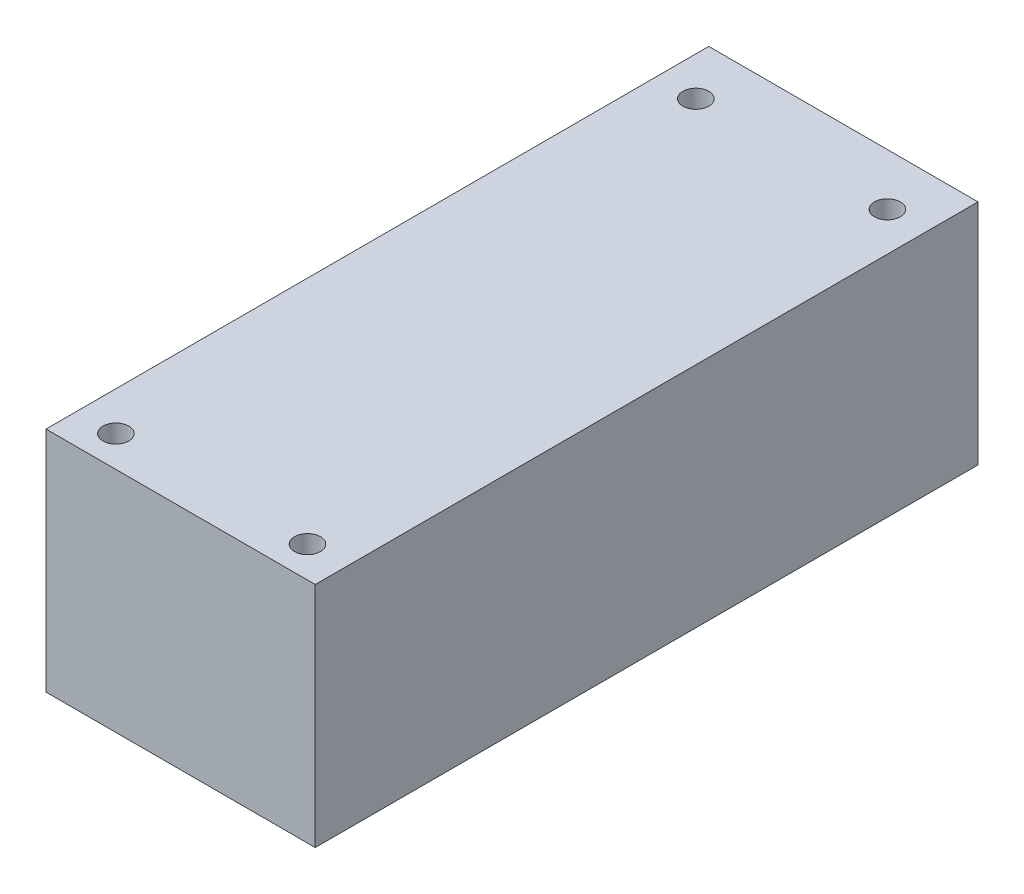
ISO-10303-21;
HEADER;
FILE_DESCRIPTION(('STEP AP214'),'2;1');
FILE_NAME('part.step','',(''),(''),'','','');
FILE_SCHEMA(('AUTOMOTIVE_DESIGN { 1 0 10303 214 1 1 1 1 }'));
ENDSEC;
DATA;
#1=APPLICATION_CONTEXT('core data for automotive mechanical design processes');
#2=APPLICATION_PROTOCOL_DEFINITION('international standard','automotive_design',2000,#1);
#3=PRODUCT_CONTEXT('',#1,'mechanical');
#4=PRODUCT('Part','Part','',(#3));
#5=PRODUCT_RELATED_PRODUCT_CATEGORY('part','',(#4));
#6=PRODUCT_DEFINITION_FORMATION('','',#4);
#7=PRODUCT_DEFINITION_CONTEXT('part definition',#1,'design');
#8=PRODUCT_DEFINITION('design','',#6,#7);
#9=PRODUCT_DEFINITION_SHAPE('','',#8);
#10=(LENGTH_UNIT() NAMED_UNIT(*) SI_UNIT(.MILLI.,.METRE.));
#11=(NAMED_UNIT(*) PLANE_ANGLE_UNIT() SI_UNIT($,.RADIAN.));
#12=(NAMED_UNIT(*) SI_UNIT($,.STERADIAN.) SOLID_ANGLE_UNIT());
#13=UNCERTAINTY_MEASURE_WITH_UNIT(LENGTH_MEASURE(1.E-05),#10,'distance_accuracy_value','');
#14=(GEOMETRIC_REPRESENTATION_CONTEXT(3) GLOBAL_UNCERTAINTY_ASSIGNED_CONTEXT((#13)) GLOBAL_UNIT_ASSIGNED_CONTEXT((#10,
#11,#12)) REPRESENTATION_CONTEXT('',''));
#15=CARTESIAN_POINT('',(0.,0.,0.));
#16=DIRECTION('',(0.,0.,1.));
#17=DIRECTION('',(1.,0.,0.));
#18=AXIS2_PLACEMENT_3D('',#15,#16,#17);
#19=CARTESIAN_POINT('',(-13.,11.,32.));
#20=DIRECTION('',(1.,0.,0.));
#21=DIRECTION('',(0.,1.,0.));
#22=AXIS2_PLACEMENT_3D('',#19,#20,#21);
#23=PLANE('',#22);
#24=DIRECTION('',(0.,-1.,0.));
#25=VECTOR('',#24,1.);
#26=CARTESIAN_POINT('',(-13.,11.,-32.));
#27=LINE('',#26,#25);
#28=CARTESIAN_POINT('',(-13.,11.,-32.));
#29=VERTEX_POINT('',#28);
#30=CARTESIAN_POINT('',(-13.,-11.,-32.));
#31=VERTEX_POINT('',#30);
#32=EDGE_CURVE('E101',#29,#31,#27,.T.);
#33=ORIENTED_EDGE('',*,*,#32,.T.);
#34=DIRECTION('',(0.,0.,-1.));
#35=VECTOR('',#34,1.);
#36=CARTESIAN_POINT('',(-13.,-11.,32.));
#37=LINE('',#36,#35);
#38=CARTESIAN_POINT('',(-13.,-11.,32.));
#39=VERTEX_POINT('',#38);
#40=EDGE_CURVE('E11',#39,#31,#37,.T.);
#41=ORIENTED_EDGE('',*,*,#40,.F.);
#42=DIRECTION('',(0.,-1.,0.));
#43=VECTOR('',#42,1.);
#44=CARTESIAN_POINT('',(-13.,11.,32.));
#45=LINE('',#44,#43);
#46=CARTESIAN_POINT('',(-13.,11.,32.));
#47=VERTEX_POINT('',#46);
#48=EDGE_CURVE('E89',#47,#39,#45,.T.);
#49=ORIENTED_EDGE('',*,*,#48,.F.);
#50=DIRECTION('',(0.,0.,-1.));
#51=VECTOR('',#50,1.);
#52=CARTESIAN_POINT('',(-13.,11.,32.));
#53=LINE('',#52,#51);
#54=EDGE_CURVE('E97',#47,#29,#53,.T.);
#55=ORIENTED_EDGE('',*,*,#54,.T.);
#56=EDGE_LOOP('',(#33,#41,#49,#55));
#57=FACE_BOUND('',#56,.T.);
#58=ADVANCED_FACE('F38',(#57),#23,.F.);
#59=CARTESIAN_POINT('',(13.,-11.,32.));
#60=DIRECTION('',(0.,1.,0.));
#61=DIRECTION('',(-1.,0.,0.));
#62=AXIS2_PLACEMENT_3D('',#59,#60,#61);
#63=PLANE('',#62);
#64=CARTESIAN_POINT('',(-9.25000000000001,-11.,29.));
#65=DIRECTION('',(0.,1.,0.));
#66=DIRECTION('',(-1.,0.,0.));
#67=AXIS2_PLACEMENT_3D('',#64,#65,#66);
#68=CIRCLE('',#67,1.25);
#69=CARTESIAN_POINT('',(-10.5,-11.,29.));
#70=VERTEX_POINT('',#69);
#71=EDGE_CURVE('E104',#70,#70,#68,.T.);
#72=ORIENTED_EDGE('',*,*,#71,.T.);
#73=EDGE_LOOP('',(#72));
#74=FACE_BOUND('',#73,.T.);
#75=CARTESIAN_POINT('',(-9.25000000000001,-11.,-27.));
#76=DIRECTION('',(0.,1.,0.));
#77=DIRECTION('',(-1.,0.,0.));
#78=AXIS2_PLACEMENT_3D('',#75,#76,#77);
#79=CIRCLE('',#78,1.25);
#80=CARTESIAN_POINT('',(-10.5,-11.,-27.));
#81=VERTEX_POINT('',#80);
#82=EDGE_CURVE('E117',#81,#81,#79,.T.);
#83=ORIENTED_EDGE('',*,*,#82,.T.);
#84=EDGE_LOOP('',(#83));
#85=FACE_BOUND('',#84,.T.);
#86=CARTESIAN_POINT('',(9.25000000000001,-11.,-27.));
#87=DIRECTION('',(0.,1.,0.));
#88=DIRECTION('',(-1.,0.,0.));
#89=AXIS2_PLACEMENT_3D('',#86,#87,#88);
#90=CIRCLE('',#89,1.25);
#91=CARTESIAN_POINT('',(8.00000000000001,-11.,-27.));
#92=VERTEX_POINT('',#91);
#93=EDGE_CURVE('E120',#92,#92,#90,.T.);
#94=ORIENTED_EDGE('',*,*,#93,.T.);
#95=EDGE_LOOP('',(#94));
#96=FACE_BOUND('',#95,.T.);
#97=CARTESIAN_POINT('',(9.25000000000001,-11.,29.));
#98=DIRECTION('',(0.,1.,0.));
#99=DIRECTION('',(-1.,0.,0.));
#100=AXIS2_PLACEMENT_3D('',#97,#98,#99);
#101=CIRCLE('',#100,1.25);
#102=CARTESIAN_POINT('',(8.00000000000001,-11.,29.));
#103=VERTEX_POINT('',#102);
#104=EDGE_CURVE('E123',#103,#103,#101,.T.);
#105=ORIENTED_EDGE('',*,*,#104,.T.);
#106=EDGE_LOOP('',(#105));
#107=FACE_BOUND('',#106,.T.);
#108=DIRECTION('',(1.,0.,0.));
#109=VECTOR('',#108,1.);
#110=CARTESIAN_POINT('',(13.,-11.,-32.));
#111=LINE('',#110,#109);
#112=CARTESIAN_POINT('',(13.,-11.,-32.));
#113=VERTEX_POINT('',#112);
#114=EDGE_CURVE('E93',#31,#113,#111,.T.);
#115=ORIENTED_EDGE('',*,*,#114,.T.);
#116=DIRECTION('',(0.,0.,-1.));
#117=VECTOR('',#116,1.);
#118=CARTESIAN_POINT('',(13.,-11.,32.));
#119=LINE('',#118,#117);
#120=CARTESIAN_POINT('',(13.,-11.,32.));
#121=VERTEX_POINT('',#120);
#122=EDGE_CURVE('E46',#121,#113,#119,.T.);
#123=ORIENTED_EDGE('',*,*,#122,.F.);
#124=DIRECTION('',(1.,0.,0.));
#125=VECTOR('',#124,1.);
#126=CARTESIAN_POINT('',(13.,-11.,32.));
#127=LINE('',#126,#125);
#128=EDGE_CURVE('E84',#39,#121,#127,.T.);
#129=ORIENTED_EDGE('',*,*,#128,.F.);
#130=ORIENTED_EDGE('',*,*,#40,.T.);
#131=EDGE_LOOP('',(#115,#123,#129,#130));
#132=FACE_BOUND('',#131,.T.);
#133=ADVANCED_FACE('F92',(#74,#85,#96,#107,#132),#63,.F.);
#134=CARTESIAN_POINT('',(13.,11.,32.));
#135=DIRECTION('',(-1.,0.,0.));
#136=DIRECTION('',(0.,0.,1.));
#137=AXIS2_PLACEMENT_3D('',#134,#135,#136);
#138=PLANE('',#137);
#139=DIRECTION('',(0.,1.,0.));
#140=VECTOR('',#139,1.);
#141=CARTESIAN_POINT('',(13.,11.,-32.));
#142=LINE('',#141,#140);
#143=CARTESIAN_POINT('',(13.,11.,-32.));
#144=VERTEX_POINT('',#143);
#145=EDGE_CURVE('E71',#113,#144,#142,.T.);
#146=ORIENTED_EDGE('',*,*,#145,.T.);
#147=DIRECTION('',(0.,0.,-1.));
#148=VECTOR('',#147,1.);
#149=CARTESIAN_POINT('',(13.,11.,32.));
#150=LINE('',#149,#148);
#151=CARTESIAN_POINT('',(13.,11.,32.));
#152=VERTEX_POINT('',#151);
#153=EDGE_CURVE('E94',#152,#144,#150,.T.);
#154=ORIENTED_EDGE('',*,*,#153,.F.);
#155=DIRECTION('',(0.,1.,0.));
#156=VECTOR('',#155,1.);
#157=CARTESIAN_POINT('',(13.,11.,32.));
#158=LINE('',#157,#156);
#159=EDGE_CURVE('E87',#121,#152,#158,.T.);
#160=ORIENTED_EDGE('',*,*,#159,.F.);
#161=ORIENTED_EDGE('',*,*,#122,.T.);
#162=EDGE_LOOP('',(#146,#154,#160,#161));
#163=FACE_BOUND('',#162,.T.);
#164=ADVANCED_FACE('F95',(#163),#138,.F.);
#165=CARTESIAN_POINT('',(13.,11.,32.));
#166=DIRECTION('',(0.,-1.,0.));
#167=DIRECTION('',(1.,0.,0.));
#168=AXIS2_PLACEMENT_3D('',#165,#166,#167);
#169=PLANE('',#168);
#170=CARTESIAN_POINT('',(-9.25000000000001,11.,29.));
#171=DIRECTION('',(0.,1.,0.));
#172=DIRECTION('',(1.,0.,0.));
#173=AXIS2_PLACEMENT_3D('',#170,#171,#172);
#174=CIRCLE('',#173,1.25);
#175=CARTESIAN_POINT('',(-8.00000000000001,11.,29.));
#176=VERTEX_POINT('',#175);
#177=EDGE_CURVE('E130',#176,#176,#174,.T.);
#178=ORIENTED_EDGE('',*,*,#177,.F.);
#179=EDGE_LOOP('',(#178));
#180=FACE_BOUND('',#179,.T.);
#181=CARTESIAN_POINT('',(-9.25000000000001,11.,-27.));
#182=DIRECTION('',(0.,1.,0.));
#183=DIRECTION('',(1.,0.,0.));
#184=AXIS2_PLACEMENT_3D('',#181,#182,#183);
#185=CIRCLE('',#184,1.25);
#186=CARTESIAN_POINT('',(-8.00000000000001,11.,-27.));
#187=VERTEX_POINT('',#186);
#188=EDGE_CURVE('E133',#187,#187,#185,.T.);
#189=ORIENTED_EDGE('',*,*,#188,.F.);
#190=EDGE_LOOP('',(#189));
#191=FACE_BOUND('',#190,.T.);
#192=CARTESIAN_POINT('',(9.25000000000001,11.,-27.));
#193=DIRECTION('',(0.,1.,0.));
#194=DIRECTION('',(-1.,0.,0.));
#195=AXIS2_PLACEMENT_3D('',#192,#193,#194);
#196=CIRCLE('',#195,1.25);
#197=CARTESIAN_POINT('',(8.00000000000001,11.,-27.));
#198=VERTEX_POINT('',#197);
#199=EDGE_CURVE('E129',#198,#198,#196,.T.);
#200=ORIENTED_EDGE('',*,*,#199,.F.);
#201=EDGE_LOOP('',(#200));
#202=FACE_BOUND('',#201,.T.);
#203=CARTESIAN_POINT('',(9.25000000000001,11.,29.));
#204=DIRECTION('',(0.,1.,0.));
#205=DIRECTION('',(-1.,0.,0.));
#206=AXIS2_PLACEMENT_3D('',#203,#204,#205);
#207=CIRCLE('',#206,1.25);
#208=CARTESIAN_POINT('',(8.00000000000001,11.,29.));
#209=VERTEX_POINT('',#208);
#210=EDGE_CURVE('E126',#209,#209,#207,.T.);
#211=ORIENTED_EDGE('',*,*,#210,.F.);
#212=EDGE_LOOP('',(#211));
#213=FACE_BOUND('',#212,.T.);
#214=DIRECTION('',(-1.,0.,0.));
#215=VECTOR('',#214,1.);
#216=CARTESIAN_POINT('',(13.,11.,-32.));
#217=LINE('',#216,#215);
#218=EDGE_CURVE('E77',#144,#29,#217,.T.);
#219=ORIENTED_EDGE('',*,*,#218,.T.);
#220=ORIENTED_EDGE('',*,*,#54,.F.);
#221=DIRECTION('',(-1.,0.,0.));
#222=VECTOR('',#221,1.);
#223=CARTESIAN_POINT('',(13.,11.,32.));
#224=LINE('',#223,#222);
#225=EDGE_CURVE('E54',#152,#47,#224,.T.);
#226=ORIENTED_EDGE('',*,*,#225,.F.);
#227=ORIENTED_EDGE('',*,*,#153,.T.);
#228=EDGE_LOOP('',(#219,#220,#226,#227));
#229=FACE_BOUND('',#228,.T.);
#230=ADVANCED_FACE('F109',(#180,#191,#202,#213,#229),#169,.F.);
#231=CARTESIAN_POINT('',(0.,0.,32.));
#232=DIRECTION('',(0.,0.,-1.));
#233=DIRECTION('',(-1.,0.,0.));
#234=AXIS2_PLACEMENT_3D('',#231,#232,#233);
#235=PLANE('',#234);
#236=ORIENTED_EDGE('',*,*,#48,.T.);
#237=ORIENTED_EDGE('',*,*,#128,.T.);
#238=ORIENTED_EDGE('',*,*,#159,.T.);
#239=ORIENTED_EDGE('',*,*,#225,.T.);
#240=EDGE_LOOP('',(#236,#237,#238,#239));
#241=FACE_BOUND('',#240,.T.);
#242=ADVANCED_FACE('F85',(#241),#235,.F.);
#243=CARTESIAN_POINT('',(0.,0.,-32.));
#244=DIRECTION('',(0.,0.,-1.));
#245=DIRECTION('',(-1.,0.,0.));
#246=AXIS2_PLACEMENT_3D('',#243,#244,#245);
#247=PLANE('',#246);
#248=ORIENTED_EDGE('',*,*,#32,.F.);
#249=ORIENTED_EDGE('',*,*,#218,.F.);
#250=ORIENTED_EDGE('',*,*,#145,.F.);
#251=ORIENTED_EDGE('',*,*,#114,.F.);
#252=EDGE_LOOP('',(#248,#249,#250,#251));
#253=FACE_BOUND('',#252,.T.);
#254=ADVANCED_FACE('F112',(#253),#247,.T.);
#255=CARTESIAN_POINT('',(9.25000000000001,-29.,29.));
#256=DIRECTION('',(0.,1.,0.));
#257=DIRECTION('',(-1.,0.,0.));
#258=AXIS2_PLACEMENT_3D('',#255,#256,#257);
#259=CYLINDRICAL_SURFACE('',#258,1.25);
#260=ORIENTED_EDGE('',*,*,#210,.T.);
#261=EDGE_LOOP('',(#260));
#262=FACE_BOUND('',#261,.T.);
#263=ORIENTED_EDGE('',*,*,#104,.F.);
#264=EDGE_LOOP('',(#263));
#265=FACE_BOUND('',#264,.T.);
#266=ADVANCED_FACE('F148',(#262,#265),#259,.F.);
#267=CARTESIAN_POINT('',(9.25000000000001,-29.,-27.));
#268=DIRECTION('',(0.,1.,0.));
#269=DIRECTION('',(-1.,0.,0.));
#270=AXIS2_PLACEMENT_3D('',#267,#268,#269);
#271=CYLINDRICAL_SURFACE('',#270,1.25);
#272=ORIENTED_EDGE('',*,*,#199,.T.);
#273=EDGE_LOOP('',(#272));
#274=FACE_BOUND('',#273,.T.);
#275=ORIENTED_EDGE('',*,*,#93,.F.);
#276=EDGE_LOOP('',(#275));
#277=FACE_BOUND('',#276,.T.);
#278=ADVANCED_FACE('F139',(#274,#277),#271,.F.);
#279=CARTESIAN_POINT('',(-9.25000000000001,-29.,-27.));
#280=DIRECTION('',(0.,1.,0.));
#281=DIRECTION('',(-1.,0.,0.));
#282=AXIS2_PLACEMENT_3D('',#279,#280,#281);
#283=CYLINDRICAL_SURFACE('',#282,1.25);
#284=ORIENTED_EDGE('',*,*,#188,.T.);
#285=EDGE_LOOP('',(#284));
#286=FACE_BOUND('',#285,.T.);
#287=ORIENTED_EDGE('',*,*,#82,.F.);
#288=EDGE_LOOP('',(#287));
#289=FACE_BOUND('',#288,.T.);
#290=ADVANCED_FACE('F170',(#286,#289),#283,.F.);
#291=CARTESIAN_POINT('',(-9.25000000000001,-29.,29.));
#292=DIRECTION('',(0.,1.,0.));
#293=DIRECTION('',(-1.,0.,0.));
#294=AXIS2_PLACEMENT_3D('',#291,#292,#293);
#295=CYLINDRICAL_SURFACE('',#294,1.25);
#296=ORIENTED_EDGE('',*,*,#177,.T.);
#297=EDGE_LOOP('',(#296));
#298=FACE_BOUND('',#297,.T.);
#299=ORIENTED_EDGE('',*,*,#71,.F.);
#300=EDGE_LOOP('',(#299));
#301=FACE_BOUND('',#300,.T.);
#302=ADVANCED_FACE('F167',(#298,#301),#295,.F.);
#303=CLOSED_SHELL('',(#58,#133,#164,#230,#242,#254,#266,#278,#290,#302));
#304=MANIFOLD_SOLID_BREP('B2',#303);
#305=ADVANCED_BREP_SHAPE_REPRESENTATION('',(#18,#304),#14);
#306=SHAPE_DEFINITION_REPRESENTATION(#9,#305);
ENDSEC;
END-ISO-10303-21;
